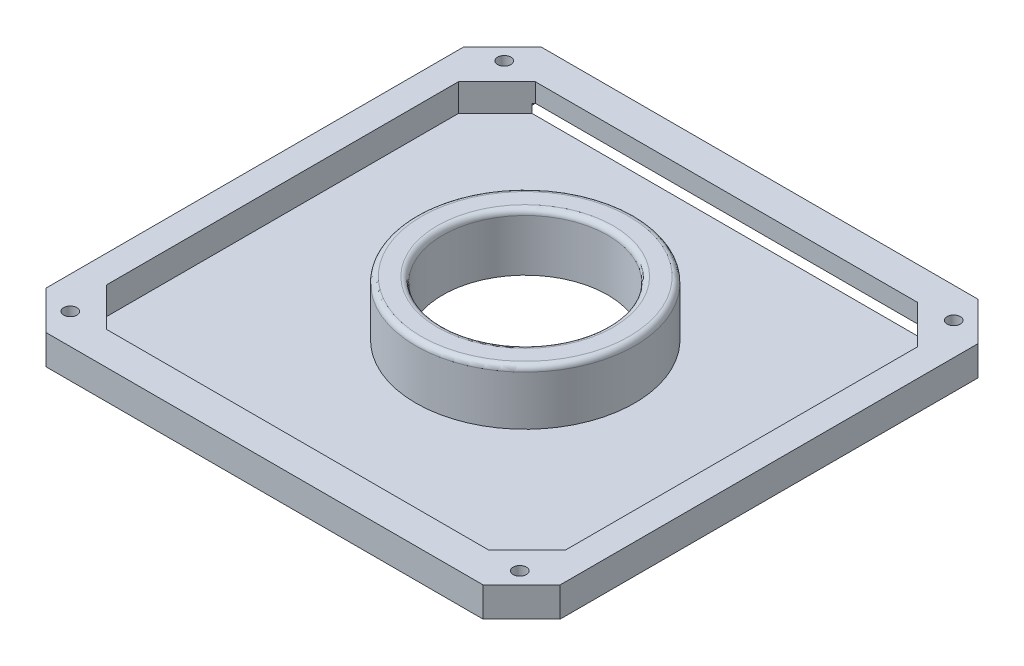
ISO-10303-21;
HEADER;
FILE_DESCRIPTION(('STEP AP214'),'2;1');
FILE_NAME('part.step','',(''),(''),'','','');
FILE_SCHEMA(('AUTOMOTIVE_DESIGN { 1 0 10303 214 1 1 1 1 }'));
ENDSEC;
DATA;
#1=APPLICATION_CONTEXT('core data for automotive mechanical design processes');
#2=APPLICATION_PROTOCOL_DEFINITION('international standard','automotive_design',2000,#1);
#3=PRODUCT_CONTEXT('',#1,'mechanical');
#4=PRODUCT('Part','Part','',(#3));
#5=PRODUCT_RELATED_PRODUCT_CATEGORY('part','',(#4));
#6=PRODUCT_DEFINITION_FORMATION('','',#4);
#7=PRODUCT_DEFINITION_CONTEXT('part definition',#1,'design');
#8=PRODUCT_DEFINITION('design','',#6,#7);
#9=PRODUCT_DEFINITION_SHAPE('','',#8);
#10=(LENGTH_UNIT() NAMED_UNIT(*) SI_UNIT(.MILLI.,.METRE.));
#11=(NAMED_UNIT(*) PLANE_ANGLE_UNIT() SI_UNIT($,.RADIAN.));
#12=(NAMED_UNIT(*) SI_UNIT($,.STERADIAN.) SOLID_ANGLE_UNIT());
#13=UNCERTAINTY_MEASURE_WITH_UNIT(LENGTH_MEASURE(1.E-05),#10,'distance_accuracy_value','');
#14=(GEOMETRIC_REPRESENTATION_CONTEXT(3) GLOBAL_UNCERTAINTY_ASSIGNED_CONTEXT((#13)) GLOBAL_UNIT_ASSIGNED_CONTEXT((#10,
#11,#12)) REPRESENTATION_CONTEXT('',''));
#15=CARTESIAN_POINT('',(0.,0.,0.));
#16=DIRECTION('',(0.,0.,1.));
#17=DIRECTION('',(1.,0.,0.));
#18=AXIS2_PLACEMENT_3D('',#15,#16,#17);
#19=CARTESIAN_POINT('',(46.75,0.,-45.));
#20=DIRECTION('',(0.,0.,-1.));
#21=DIRECTION('',(-1.,0.,0.));
#22=AXIS2_PLACEMENT_3D('',#19,#20,#21);
#23=PLANE('',#22);
#24=DIRECTION('',(-1.,0.,0.));
#25=VECTOR('',#24,1.);
#26=CARTESIAN_POINT('',(46.75,0.,-45.));
#27=LINE('',#26,#25);
#28=CARTESIAN_POINT('',(39.7499999999999,0.,-45.));
#29=VERTEX_POINT('',#28);
#30=CARTESIAN_POINT('',(36.75,0.,-45.));
#31=VERTEX_POINT('',#30);
#32=EDGE_CURVE('E222',#29,#31,#27,.T.);
#33=ORIENTED_EDGE('',*,*,#32,.T.);
#34=DIRECTION('',(0.,-1.,0.));
#35=VECTOR('',#34,1.);
#36=CARTESIAN_POINT('',(36.75,2.,-45.));
#37=LINE('',#36,#35);
#38=CARTESIAN_POINT('',(36.75,2.,-45.));
#39=VERTEX_POINT('',#38);
#40=EDGE_CURVE('E203',#39,#31,#37,.T.);
#41=ORIENTED_EDGE('',*,*,#40,.F.);
#42=DIRECTION('',(-1.,0.,0.));
#43=VECTOR('',#42,1.);
#44=CARTESIAN_POINT('',(36.75,2.,-45.));
#45=LINE('',#44,#43);
#46=CARTESIAN_POINT('',(-36.75,2.,-45.));
#47=VERTEX_POINT('',#46);
#48=EDGE_CURVE('E210',#39,#47,#45,.T.);
#49=ORIENTED_EDGE('',*,*,#48,.T.);
#50=DIRECTION('',(0.,-1.,0.));
#51=VECTOR('',#50,1.);
#52=CARTESIAN_POINT('',(-36.75,2.,-45.));
#53=LINE('',#52,#51);
#54=CARTESIAN_POINT('',(-36.75,0.,-45.));
#55=VERTEX_POINT('',#54);
#56=EDGE_CURVE('E228',#47,#55,#53,.T.);
#57=ORIENTED_EDGE('',*,*,#56,.T.);
#58=CARTESIAN_POINT('',(-39.75,0.,-45.));
#59=VERTEX_POINT('',#58);
#60=EDGE_CURVE('E281',#55,#59,#27,.T.);
#61=ORIENTED_EDGE('',*,*,#60,.T.);
#62=DIRECTION('',(0.,1.,0.));
#63=VECTOR('',#62,1.);
#64=CARTESIAN_POINT('',(-39.75,0.,-45.));
#65=LINE('',#64,#63);
#66=CARTESIAN_POINT('',(-39.75,5.4,-45.));
#67=VERTEX_POINT('',#66);
#68=EDGE_CURVE('E333',#59,#67,#65,.T.);
#69=ORIENTED_EDGE('',*,*,#68,.T.);
#70=DIRECTION('',(-1.,0.,0.));
#71=VECTOR('',#70,1.);
#72=CARTESIAN_POINT('',(46.75,5.4,-45.));
#73=LINE('',#72,#71);
#74=CARTESIAN_POINT('',(39.7499999999999,5.4,-45.));
#75=VERTEX_POINT('',#74);
#76=EDGE_CURVE('E278',#75,#67,#73,.T.);
#77=ORIENTED_EDGE('',*,*,#76,.F.);
#78=DIRECTION('',(0.,-1.,0.));
#79=VECTOR('',#78,1.);
#80=CARTESIAN_POINT('',(39.7499999999999,0.,-45.));
#81=LINE('',#80,#79);
#82=EDGE_CURVE('E329',#75,#29,#81,.T.);
#83=ORIENTED_EDGE('',*,*,#82,.T.);
#84=EDGE_LOOP('',(#33,#41,#49,#57,#61,#69,#77,#83));
#85=FACE_BOUND('',#84,.T.);
#86=ADVANCED_FACE('F35',(#85),#23,.T.);
#87=CARTESIAN_POINT('',(0.,0.,0.));
#88=DIRECTION('',(0.,1.,0.));
#89=DIRECTION('',(0.,0.,1.));
#90=AXIS2_PLACEMENT_3D('',#87,#88,#89);
#91=PLANE('',#90);
#92=CARTESIAN_POINT('',(-6.84106249782944E-12,0.,-2.40478802439185));
#93=DIRECTION('',(0.,1.,0.));
#94=DIRECTION('',(0.,0.,1.));
#95=AXIS2_PLACEMENT_3D('',#92,#93,#94);
#96=CIRCLE('',#95,15.);
#97=CARTESIAN_POINT('',(-6.84106249782944E-12,0.,12.5952119756082));
#98=VERTEX_POINT('',#97);
#99=EDGE_CURVE('E418',#98,#98,#96,.T.);
#100=ORIENTED_EDGE('',*,*,#99,.T.);
#101=EDGE_LOOP('',(#100));
#102=FACE_BOUND('',#101,.T.);
#103=CARTESIAN_POINT('',(-40.8711804126844,0.,39.4578599479724));
#104=DIRECTION('',(0.,1.,0.));
#105=DIRECTION('',(0.,0.,1.));
#106=AXIS2_PLACEMENT_3D('',#103,#104,#105);
#107=CIRCLE('',#106,1.19999999999998);
#108=CARTESIAN_POINT('',(-40.8711804126844,0.,40.6578599479724));
#109=VERTEX_POINT('',#108);
#110=EDGE_CURVE('E423',#109,#109,#107,.T.);
#111=ORIENTED_EDGE('',*,*,#110,.T.);
#112=EDGE_LOOP('',(#111));
#113=FACE_BOUND('',#112,.T.);
#114=CARTESIAN_POINT('',(-40.8711804126844,0.,-39.4578599479724));
#115=DIRECTION('',(0.,1.,0.));
#116=DIRECTION('',(0.,0.,1.));
#117=AXIS2_PLACEMENT_3D('',#114,#115,#116);
#118=CIRCLE('',#117,1.19999999999998);
#119=CARTESIAN_POINT('',(-40.8711804126844,0.,-38.2578599479724));
#120=VERTEX_POINT('',#119);
#121=EDGE_CURVE('E431',#120,#120,#118,.T.);
#122=ORIENTED_EDGE('',*,*,#121,.T.);
#123=EDGE_LOOP('',(#122));
#124=FACE_BOUND('',#123,.T.);
#125=CARTESIAN_POINT('',(40.8711804126844,0.,-39.4578599479724));
#126=DIRECTION('',(0.,1.,0.));
#127=DIRECTION('',(0.,0.,1.));
#128=AXIS2_PLACEMENT_3D('',#125,#126,#127);
#129=CIRCLE('',#128,1.19999999999998);
#130=CARTESIAN_POINT('',(40.8711804126844,0.,-38.2578599479724));
#131=VERTEX_POINT('',#130);
#132=EDGE_CURVE('E437',#131,#131,#129,.T.);
#133=ORIENTED_EDGE('',*,*,#132,.T.);
#134=EDGE_LOOP('',(#133));
#135=FACE_BOUND('',#134,.T.);
#136=CARTESIAN_POINT('',(40.8711804126844,0.,39.4578599479724));
#137=DIRECTION('',(0.,1.,0.));
#138=DIRECTION('',(0.,0.,1.));
#139=AXIS2_PLACEMENT_3D('',#136,#137,#138);
#140=CIRCLE('',#139,1.19999999999998);
#141=CARTESIAN_POINT('',(40.8711804126844,0.,40.6578599479724));
#142=VERTEX_POINT('',#141);
#143=EDGE_CURVE('E443',#142,#142,#140,.T.);
#144=ORIENTED_EDGE('',*,*,#143,.T.);
#145=EDGE_LOOP('',(#144));
#146=FACE_BOUND('',#145,.T.);
#147=DIRECTION('',(0.,0.,1.));
#148=VECTOR('',#147,1.);
#149=CARTESIAN_POINT('',(36.75,0.,-45.));
#150=LINE('',#149,#148);
#151=CARTESIAN_POINT('',(36.75,0.,-39.7047880243918));
#152=VERTEX_POINT('',#151);
#153=EDGE_CURVE('E218',#31,#152,#150,.T.);
#154=ORIENTED_EDGE('',*,*,#153,.F.);
#155=ORIENTED_EDGE('',*,*,#32,.F.);
#156=DIRECTION('',(-0.70710678118655,0.,-0.707106781186545));
#157=VECTOR('',#156,1.);
#158=CARTESIAN_POINT('',(46.75,0.,-38.));
#159=LINE('',#158,#157);
#160=CARTESIAN_POINT('',(46.75,0.,-38.));
#161=VERTEX_POINT('',#160);
#162=EDGE_CURVE('E331',#29,#161,#159,.F.);
#163=ORIENTED_EDGE('',*,*,#162,.T.);
#164=DIRECTION('',(0.,0.,-1.));
#165=VECTOR('',#164,1.);
#166=CARTESIAN_POINT('',(46.75,0.,45.));
#167=LINE('',#166,#165);
#168=CARTESIAN_POINT('',(46.75,0.,38.));
#169=VERTEX_POINT('',#168);
#170=EDGE_CURVE('E286',#169,#161,#167,.T.);
#171=ORIENTED_EDGE('',*,*,#170,.F.);
#172=DIRECTION('',(0.707106781186546,0.,-0.707106781186549));
#173=VECTOR('',#172,1.);
#174=CARTESIAN_POINT('',(39.75,0.,45.));
#175=LINE('',#174,#173);
#176=CARTESIAN_POINT('',(39.75,0.,45.));
#177=VERTEX_POINT('',#176);
#178=EDGE_CURVE('E321',#169,#177,#175,.F.);
#179=ORIENTED_EDGE('',*,*,#178,.T.);
#180=DIRECTION('',(1.,0.,0.));
#181=VECTOR('',#180,1.);
#182=CARTESIAN_POINT('',(-46.75,0.,45.));
#183=LINE('',#182,#181);
#184=CARTESIAN_POINT('',(-39.75,0.,45.));
#185=VERTEX_POINT('',#184);
#186=EDGE_CURVE('E284',#185,#177,#183,.T.);
#187=ORIENTED_EDGE('',*,*,#186,.F.);
#188=DIRECTION('',(0.70710678118655,0.,0.707106781186545));
#189=VECTOR('',#188,1.);
#190=CARTESIAN_POINT('',(-46.75,0.,38.));
#191=LINE('',#190,#189);
#192=CARTESIAN_POINT('',(-46.75,0.,38.));
#193=VERTEX_POINT('',#192);
#194=EDGE_CURVE('E360',#185,#193,#191,.F.);
#195=ORIENTED_EDGE('',*,*,#194,.T.);
#196=DIRECTION('',(0.,0.,1.));
#197=VECTOR('',#196,1.);
#198=CARTESIAN_POINT('',(-46.75,0.,-45.));
#199=LINE('',#198,#197);
#200=CARTESIAN_POINT('',(-46.75,0.,-38.));
#201=VERTEX_POINT('',#200);
#202=EDGE_CURVE('E280',#201,#193,#199,.T.);
#203=ORIENTED_EDGE('',*,*,#202,.F.);
#204=DIRECTION('',(-0.707106781186545,0.,0.70710678118655));
#205=VECTOR('',#204,1.);
#206=CARTESIAN_POINT('',(-39.75,0.,-45.));
#207=LINE('',#206,#205);
#208=EDGE_CURVE('E340',#201,#59,#207,.F.);
#209=ORIENTED_EDGE('',*,*,#208,.T.);
#210=ORIENTED_EDGE('',*,*,#60,.F.);
#211=DIRECTION('',(0.,0.,1.));
#212=VECTOR('',#211,1.);
#213=CARTESIAN_POINT('',(-36.75,0.,-45.));
#214=LINE('',#213,#212);
#215=CARTESIAN_POINT('',(-36.75,0.,-39.7047880243918));
#216=VERTEX_POINT('',#215);
#217=EDGE_CURVE('E207',#55,#216,#214,.T.);
#218=ORIENTED_EDGE('',*,*,#217,.T.);
#219=CARTESIAN_POINT('',(-35.75,0.,-39.7047880243918));
#220=DIRECTION('',(0.,1.,0.));
#221=DIRECTION('',(0.,0.,1.));
#222=AXIS2_PLACEMENT_3D('',#219,#220,#221);
#223=CIRCLE('',#222,1.);
#224=CARTESIAN_POINT('',(-35.75,0.,-38.7047880243918));
#225=VERTEX_POINT('',#224);
#226=EDGE_CURVE('E379',#216,#225,#223,.T.);
#227=ORIENTED_EDGE('',*,*,#226,.T.);
#228=DIRECTION('',(-1.,0.,0.));
#229=VECTOR('',#228,1.);
#230=CARTESIAN_POINT('',(36.75,0.,-38.7047880243918));
#231=LINE('',#230,#229);
#232=CARTESIAN_POINT('',(35.75,0.,-38.7047880243918));
#233=VERTEX_POINT('',#232);
#234=EDGE_CURVE('E217',#233,#225,#231,.T.);
#235=ORIENTED_EDGE('',*,*,#234,.F.);
#236=CARTESIAN_POINT('',(35.75,0.,-39.7047880243918));
#237=DIRECTION('',(0.,1.,0.));
#238=DIRECTION('',(0.,0.,1.));
#239=AXIS2_PLACEMENT_3D('',#236,#237,#238);
#240=CIRCLE('',#239,1.);
#241=EDGE_CURVE('E50',#233,#152,#240,.T.);
#242=ORIENTED_EDGE('',*,*,#241,.T.);
#243=EDGE_LOOP('',(#154,#155,#163,#171,#179,#187,#195,#203,#209,#210,#218,#227,#235,#242));
#244=FACE_BOUND('',#243,.T.);
#245=ADVANCED_FACE('F503',(#102,#113,#124,#135,#146,#244),#91,.F.);
#246=CARTESIAN_POINT('',(46.75,0.,45.));
#247=DIRECTION('',(1.,0.,0.));
#248=DIRECTION('',(0.,0.,-1.));
#249=AXIS2_PLACEMENT_3D('',#246,#247,#248);
#250=PLANE('',#249);
#251=ORIENTED_EDGE('',*,*,#170,.T.);
#252=DIRECTION('',(0.,1.,0.));
#253=VECTOR('',#252,1.);
#254=CARTESIAN_POINT('',(46.75,0.,-38.));
#255=LINE('',#254,#253);
#256=CARTESIAN_POINT('',(46.75,5.4,-38.));
#257=VERTEX_POINT('',#256);
#258=EDGE_CURVE('E324',#161,#257,#255,.T.);
#259=ORIENTED_EDGE('',*,*,#258,.T.);
#260=DIRECTION('',(0.,0.,-1.));
#261=VECTOR('',#260,1.);
#262=CARTESIAN_POINT('',(46.75,5.4,45.));
#263=LINE('',#262,#261);
#264=CARTESIAN_POINT('',(46.75,5.4,38.));
#265=VERTEX_POINT('',#264);
#266=EDGE_CURVE('E297',#265,#257,#263,.T.);
#267=ORIENTED_EDGE('',*,*,#266,.F.);
#268=DIRECTION('',(0.,-1.,0.));
#269=VECTOR('',#268,1.);
#270=CARTESIAN_POINT('',(46.75,0.,38.));
#271=LINE('',#270,#269);
#272=EDGE_CURVE('E319',#265,#169,#271,.T.);
#273=ORIENTED_EDGE('',*,*,#272,.T.);
#274=EDGE_LOOP('',(#251,#259,#267,#273));
#275=FACE_BOUND('',#274,.T.);
#276=ADVANCED_FACE('F519',(#275),#250,.T.);
#277=CARTESIAN_POINT('',(-46.75,0.,45.));
#278=DIRECTION('',(0.,0.,1.));
#279=DIRECTION('',(1.,0.,0.));
#280=AXIS2_PLACEMENT_3D('',#277,#278,#279);
#281=PLANE('',#280);
#282=DIRECTION('',(1.,0.,0.));
#283=VECTOR('',#282,1.);
#284=CARTESIAN_POINT('',(-46.75,5.4,45.));
#285=LINE('',#284,#283);
#286=CARTESIAN_POINT('',(-39.75,5.4,45.));
#287=VERTEX_POINT('',#286);
#288=CARTESIAN_POINT('',(39.75,5.4,45.));
#289=VERTEX_POINT('',#288);
#290=EDGE_CURVE('E295',#287,#289,#285,.T.);
#291=ORIENTED_EDGE('',*,*,#290,.F.);
#292=DIRECTION('',(0.,-1.,0.));
#293=VECTOR('',#292,1.);
#294=CARTESIAN_POINT('',(-39.75,0.,45.));
#295=LINE('',#294,#293);
#296=EDGE_CURVE('E358',#287,#185,#295,.T.);
#297=ORIENTED_EDGE('',*,*,#296,.T.);
#298=ORIENTED_EDGE('',*,*,#186,.T.);
#299=DIRECTION('',(0.,1.,0.));
#300=VECTOR('',#299,1.);
#301=CARTESIAN_POINT('',(39.75,0.,45.));
#302=LINE('',#301,#300);
#303=EDGE_CURVE('E314',#177,#289,#302,.T.);
#304=ORIENTED_EDGE('',*,*,#303,.T.);
#305=EDGE_LOOP('',(#291,#297,#298,#304));
#306=FACE_BOUND('',#305,.T.);
#307=ADVANCED_FACE('F530',(#306),#281,.T.);
#308=CARTESIAN_POINT('',(-46.75,0.,-45.));
#309=DIRECTION('',(-1.,0.,0.));
#310=DIRECTION('',(0.,0.,1.));
#311=AXIS2_PLACEMENT_3D('',#308,#309,#310);
#312=PLANE('',#311);
#313=ORIENTED_EDGE('',*,*,#202,.T.);
#314=DIRECTION('',(0.,1.,0.));
#315=VECTOR('',#314,1.);
#316=CARTESIAN_POINT('',(-46.75,0.,38.));
#317=LINE('',#316,#315);
#318=CARTESIAN_POINT('',(-46.75,5.4,38.));
#319=VERTEX_POINT('',#318);
#320=EDGE_CURVE('E353',#193,#319,#317,.T.);
#321=ORIENTED_EDGE('',*,*,#320,.T.);
#322=DIRECTION('',(0.,0.,1.));
#323=VECTOR('',#322,1.);
#324=CARTESIAN_POINT('',(-46.75,5.4,-45.));
#325=LINE('',#324,#323);
#326=CARTESIAN_POINT('',(-46.75,5.4,-38.));
#327=VERTEX_POINT('',#326);
#328=EDGE_CURVE('E292',#327,#319,#325,.T.);
#329=ORIENTED_EDGE('',*,*,#328,.F.);
#330=DIRECTION('',(0.,-1.,0.));
#331=VECTOR('',#330,1.);
#332=CARTESIAN_POINT('',(-46.75,0.,-38.));
#333=LINE('',#332,#331);
#334=EDGE_CURVE('E338',#327,#201,#333,.T.);
#335=ORIENTED_EDGE('',*,*,#334,.T.);
#336=EDGE_LOOP('',(#313,#321,#329,#335));
#337=FACE_BOUND('',#336,.T.);
#338=ADVANCED_FACE('F537',(#337),#312,.T.);
#339=CARTESIAN_POINT('',(0.,5.4,0.));
#340=DIRECTION('',(0.,1.,0.));
#341=DIRECTION('',(0.,0.,1.));
#342=AXIS2_PLACEMENT_3D('',#339,#340,#341);
#343=PLANE('',#342);
#344=CARTESIAN_POINT('',(-40.8711804126844,5.4,39.4578599479724));
#345=DIRECTION('',(0.,1.,0.));
#346=DIRECTION('',(0.,0.,1.));
#347=AXIS2_PLACEMENT_3D('',#344,#345,#346);
#348=CIRCLE('',#347,1.19999999999998);
#349=CARTESIAN_POINT('',(-40.8711804126844,5.4,40.6578599479724));
#350=VERTEX_POINT('',#349);
#351=EDGE_CURVE('E420',#350,#350,#348,.T.);
#352=ORIENTED_EDGE('',*,*,#351,.F.);
#353=EDGE_LOOP('',(#352));
#354=FACE_BOUND('',#353,.T.);
#355=CARTESIAN_POINT('',(-40.8711804126844,5.4,-39.4578599479724));
#356=DIRECTION('',(0.,1.,0.));
#357=DIRECTION('',(0.,0.,1.));
#358=AXIS2_PLACEMENT_3D('',#355,#356,#357);
#359=CIRCLE('',#358,1.19999999999998);
#360=CARTESIAN_POINT('',(-40.8711804126844,5.4,-38.2578599479724));
#361=VERTEX_POINT('',#360);
#362=EDGE_CURVE('E428',#361,#361,#359,.T.);
#363=ORIENTED_EDGE('',*,*,#362,.F.);
#364=EDGE_LOOP('',(#363));
#365=FACE_BOUND('',#364,.T.);
#366=CARTESIAN_POINT('',(40.8711804126844,5.4,-39.4578599479724));
#367=DIRECTION('',(0.,1.,0.));
#368=DIRECTION('',(0.,0.,1.));
#369=AXIS2_PLACEMENT_3D('',#366,#367,#368);
#370=CIRCLE('',#369,1.19999999999998);
#371=CARTESIAN_POINT('',(40.8711804126844,5.4,-38.2578599479724));
#372=VERTEX_POINT('',#371);
#373=EDGE_CURVE('E434',#372,#372,#370,.T.);
#374=ORIENTED_EDGE('',*,*,#373,.F.);
#375=EDGE_LOOP('',(#374));
#376=FACE_BOUND('',#375,.T.);
#377=CARTESIAN_POINT('',(40.8711804126844,5.4,39.4578599479724));
#378=DIRECTION('',(0.,1.,0.));
#379=DIRECTION('',(0.,0.,1.));
#380=AXIS2_PLACEMENT_3D('',#377,#378,#379);
#381=CIRCLE('',#380,1.19999999999998);
#382=CARTESIAN_POINT('',(40.8711804126844,5.4,40.6578599479724));
#383=VERTEX_POINT('',#382);
#384=EDGE_CURVE('E440',#383,#383,#381,.T.);
#385=ORIENTED_EDGE('',*,*,#384,.F.);
#386=EDGE_LOOP('',(#385));
#387=FACE_BOUND('',#386,.T.);
#388=DIRECTION('',(-1.,0.,0.));
#389=VECTOR('',#388,1.);
#390=CARTESIAN_POINT('',(41.75,5.4,39.));
#391=LINE('',#390,#389);
#392=CARTESIAN_POINT('',(34.75,5.4,39.));
#393=VERTEX_POINT('',#392);
#394=CARTESIAN_POINT('',(-34.75,5.4,39.));
#395=VERTEX_POINT('',#394);
#396=EDGE_CURVE('E268',#393,#395,#391,.T.);
#397=ORIENTED_EDGE('',*,*,#396,.T.);
#398=DIRECTION('',(0.707106781186551,0.,0.707106781186544));
#399=VECTOR('',#398,1.);
#400=CARTESIAN_POINT('',(-41.75,5.4,32.));
#401=LINE('',#400,#399);
#402=CARTESIAN_POINT('',(-41.75,5.4,32.));
#403=VERTEX_POINT('',#402);
#404=EDGE_CURVE('E366',#395,#403,#401,.F.);
#405=ORIENTED_EDGE('',*,*,#404,.T.);
#406=DIRECTION('',(0.,0.,-1.));
#407=VECTOR('',#406,1.);
#408=CARTESIAN_POINT('',(-41.75,5.4,39.));
#409=LINE('',#408,#407);
#410=CARTESIAN_POINT('',(-41.75,5.4,-32.));
#411=VERTEX_POINT('',#410);
#412=EDGE_CURVE('E271',#403,#411,#409,.T.);
#413=ORIENTED_EDGE('',*,*,#412,.T.);
#414=DIRECTION('',(-0.707106781186551,0.,0.707106781186544));
#415=VECTOR('',#414,1.);
#416=CARTESIAN_POINT('',(-34.75,5.4,-39.));
#417=LINE('',#416,#415);
#418=CARTESIAN_POINT('',(-34.75,5.4,-39.));
#419=VERTEX_POINT('',#418);
#420=EDGE_CURVE('E351',#411,#419,#417,.F.);
#421=ORIENTED_EDGE('',*,*,#420,.T.);
#422=DIRECTION('',(1.,0.,0.));
#423=VECTOR('',#422,1.);
#424=CARTESIAN_POINT('',(-41.75,5.4,-39.));
#425=LINE('',#424,#423);
#426=CARTESIAN_POINT('',(34.75,5.4,-39.));
#427=VERTEX_POINT('',#426);
#428=EDGE_CURVE('E276',#419,#427,#425,.T.);
#429=ORIENTED_EDGE('',*,*,#428,.T.);
#430=DIRECTION('',(-0.707106781186549,0.,-0.707106781186546));
#431=VECTOR('',#430,1.);
#432=CARTESIAN_POINT('',(41.75,5.4,-32.));
#433=LINE('',#432,#431);
#434=CARTESIAN_POINT('',(41.75,5.4,-32.));
#435=VERTEX_POINT('',#434);
#436=EDGE_CURVE('E306',#427,#435,#433,.F.);
#437=ORIENTED_EDGE('',*,*,#436,.T.);
#438=DIRECTION('',(0.,0.,1.));
#439=VECTOR('',#438,1.);
#440=CARTESIAN_POINT('',(41.75,5.4,-39.));
#441=LINE('',#440,#439);
#442=CARTESIAN_POINT('',(41.75,5.4,32.));
#443=VERTEX_POINT('',#442);
#444=EDGE_CURVE('E264',#435,#443,#441,.T.);
#445=ORIENTED_EDGE('',*,*,#444,.T.);
#446=DIRECTION('',(0.707106781186545,0.,-0.70710678118655));
#447=VECTOR('',#446,1.);
#448=CARTESIAN_POINT('',(34.75,5.4,39.));
#449=LINE('',#448,#447);
#450=EDGE_CURVE('E312',#443,#393,#449,.F.);
#451=ORIENTED_EDGE('',*,*,#450,.T.);
#452=EDGE_LOOP('',(#397,#405,#413,#421,#429,#437,#445,#451));
#453=FACE_BOUND('',#452,.T.);
#454=ORIENTED_EDGE('',*,*,#328,.T.);
#455=DIRECTION('',(-0.70710678118655,0.,-0.707106781186545));
#456=VECTOR('',#455,1.);
#457=CARTESIAN_POINT('',(-42.3749999999998,5.4,42.3750000000001));
#458=LINE('',#457,#456);
#459=EDGE_CURVE('E356',#319,#287,#458,.F.);
#460=ORIENTED_EDGE('',*,*,#459,.T.);
#461=ORIENTED_EDGE('',*,*,#290,.T.);
#462=DIRECTION('',(-0.707106781186546,0.,0.707106781186549));
#463=VECTOR('',#462,1.);
#464=CARTESIAN_POINT('',(42.3750000000001,5.4,42.3749999999999));
#465=LINE('',#464,#463);
#466=EDGE_CURVE('E317',#289,#265,#465,.F.);
#467=ORIENTED_EDGE('',*,*,#466,.T.);
#468=ORIENTED_EDGE('',*,*,#266,.T.);
#469=DIRECTION('',(0.70710678118655,0.,0.707106781186545));
#470=VECTOR('',#469,1.);
#471=CARTESIAN_POINT('',(42.3749999999999,5.4,-42.3750000000001));
#472=LINE('',#471,#470);
#473=EDGE_CURVE('E327',#257,#75,#472,.F.);
#474=ORIENTED_EDGE('',*,*,#473,.T.);
#475=ORIENTED_EDGE('',*,*,#76,.T.);
#476=DIRECTION('',(0.707106781186545,0.,-0.70710678118655));
#477=VECTOR('',#476,1.);
#478=CARTESIAN_POINT('',(-42.3750000000001,5.4,-42.3749999999999));
#479=LINE('',#478,#477);
#480=EDGE_CURVE('E336',#67,#327,#479,.F.);
#481=ORIENTED_EDGE('',*,*,#480,.T.);
#482=EDGE_LOOP('',(#454,#460,#461,#467,#468,#474,#475,#481));
#483=FACE_BOUND('',#482,.T.);
#484=ADVANCED_FACE('F476',(#354,#365,#376,#387,#453,#483),#343,.T.);
#485=CARTESIAN_POINT('',(-41.75,5.401,39.));
#486=DIRECTION('',(-1.,0.,0.));
#487=DIRECTION('',(0.,0.,1.));
#488=AXIS2_PLACEMENT_3D('',#485,#486,#487);
#489=PLANE('',#488);
#490=ORIENTED_EDGE('',*,*,#412,.F.);
#491=DIRECTION('',(0.,-1.,0.));
#492=VECTOR('',#491,1.);
#493=CARTESIAN_POINT('',(-41.75,2.,32.));
#494=LINE('',#493,#492);
#495=CARTESIAN_POINT('',(-41.75,0.400000000000001,32.));
#496=VERTEX_POINT('',#495);
#497=EDGE_CURVE('E362',#403,#496,#494,.T.);
#498=ORIENTED_EDGE('',*,*,#497,.T.);
#499=DIRECTION('',(0.,0.,-1.));
#500=VECTOR('',#499,1.);
#501=CARTESIAN_POINT('',(-41.75,0.400000000000001,32.));
#502=LINE('',#501,#500);
#503=CARTESIAN_POINT('',(-41.75,0.400000000000001,-32.));
#504=VERTEX_POINT('',#503);
#505=EDGE_CURVE('E234',#496,#504,#502,.T.);
#506=ORIENTED_EDGE('',*,*,#505,.T.);
#507=DIRECTION('',(0.,1.,0.));
#508=VECTOR('',#507,1.);
#509=CARTESIAN_POINT('',(-41.75,5.4,-32.));
#510=LINE('',#509,#508);
#511=EDGE_CURVE('E348',#504,#411,#510,.T.);
#512=ORIENTED_EDGE('',*,*,#511,.T.);
#513=EDGE_LOOP('',(#490,#498,#506,#512));
#514=FACE_BOUND('',#513,.T.);
#515=ADVANCED_FACE('F494',(#514),#489,.F.);
#516=CARTESIAN_POINT('',(41.75,5.401,39.));
#517=DIRECTION('',(0.,0.,1.));
#518=DIRECTION('',(1.,0.,0.));
#519=AXIS2_PLACEMENT_3D('',#516,#517,#518);
#520=PLANE('',#519);
#521=DIRECTION('',(0.,-1.,0.));
#522=VECTOR('',#521,1.);
#523=CARTESIAN_POINT('',(34.75,2.,39.));
#524=LINE('',#523,#522);
#525=CARTESIAN_POINT('',(34.75,0.400000000000001,39.));
#526=VERTEX_POINT('',#525);
#527=EDGE_CURVE('E308',#393,#526,#524,.T.);
#528=ORIENTED_EDGE('',*,*,#527,.T.);
#529=DIRECTION('',(-1.,0.,0.));
#530=VECTOR('',#529,1.);
#531=CARTESIAN_POINT('',(34.75,0.400000000000001,39.));
#532=LINE('',#531,#530);
#533=CARTESIAN_POINT('',(-34.75,0.400000000000001,39.));
#534=VERTEX_POINT('',#533);
#535=EDGE_CURVE('E254',#526,#534,#532,.T.);
#536=ORIENTED_EDGE('',*,*,#535,.T.);
#537=DIRECTION('',(0.,1.,0.));
#538=VECTOR('',#537,1.);
#539=CARTESIAN_POINT('',(-34.75,5.4,39.));
#540=LINE('',#539,#538);
#541=EDGE_CURVE('E364',#534,#395,#540,.T.);
#542=ORIENTED_EDGE('',*,*,#541,.T.);
#543=ORIENTED_EDGE('',*,*,#396,.F.);
#544=EDGE_LOOP('',(#528,#536,#542,#543));
#545=FACE_BOUND('',#544,.T.);
#546=ADVANCED_FACE('F464',(#545),#520,.F.);
#547=CARTESIAN_POINT('',(41.75,5.401,-39.));
#548=DIRECTION('',(1.,0.,0.));
#549=DIRECTION('',(0.,0.,-1.));
#550=AXIS2_PLACEMENT_3D('',#547,#548,#549);
#551=PLANE('',#550);
#552=DIRECTION('',(0.,-1.,0.));
#553=VECTOR('',#552,1.);
#554=CARTESIAN_POINT('',(41.75,2.,-32.));
#555=LINE('',#554,#553);
#556=CARTESIAN_POINT('',(41.75,0.400000000000001,-32.));
#557=VERTEX_POINT('',#556);
#558=EDGE_CURVE('E289',#435,#557,#555,.T.);
#559=ORIENTED_EDGE('',*,*,#558,.T.);
#560=DIRECTION('',(0.,0.,1.));
#561=VECTOR('',#560,1.);
#562=CARTESIAN_POINT('',(41.75,0.400000000000001,-32.));
#563=LINE('',#562,#561);
#564=CARTESIAN_POINT('',(41.75,0.400000000000001,32.));
#565=VERTEX_POINT('',#564);
#566=EDGE_CURVE('E248',#557,#565,#563,.T.);
#567=ORIENTED_EDGE('',*,*,#566,.T.);
#568=DIRECTION('',(0.,1.,0.));
#569=VECTOR('',#568,1.);
#570=CARTESIAN_POINT('',(41.75,5.4,32.));
#571=LINE('',#570,#569);
#572=EDGE_CURVE('E310',#565,#443,#571,.T.);
#573=ORIENTED_EDGE('',*,*,#572,.T.);
#574=ORIENTED_EDGE('',*,*,#444,.F.);
#575=EDGE_LOOP('',(#559,#567,#573,#574));
#576=FACE_BOUND('',#575,.T.);
#577=ADVANCED_FACE('F473',(#576),#551,.F.);
#578=CARTESIAN_POINT('',(-41.75,5.401,-39.));
#579=DIRECTION('',(0.,0.,-1.));
#580=DIRECTION('',(-1.,0.,0.));
#581=AXIS2_PLACEMENT_3D('',#578,#579,#580);
#582=PLANE('',#581);
#583=ORIENTED_EDGE('',*,*,#428,.F.);
#584=DIRECTION('',(0.,-1.,0.));
#585=VECTOR('',#584,1.);
#586=CARTESIAN_POINT('',(-34.75,2.,-39.));
#587=LINE('',#586,#585);
#588=CARTESIAN_POINT('',(-34.75,2.,-39.));
#589=VERTEX_POINT('',#588);
#590=EDGE_CURVE('E343',#419,#589,#587,.T.);
#591=ORIENTED_EDGE('',*,*,#590,.T.);
#592=DIRECTION('',(1.,0.,0.));
#593=VECTOR('',#592,1.);
#594=CARTESIAN_POINT('',(-41.75,2.,-39.));
#595=LINE('',#594,#593);
#596=CARTESIAN_POINT('',(34.75,2.,-39.));
#597=VERTEX_POINT('',#596);
#598=EDGE_CURVE('E273',#589,#597,#595,.T.);
#599=ORIENTED_EDGE('',*,*,#598,.T.);
#600=DIRECTION('',(0.,1.,0.));
#601=VECTOR('',#600,1.);
#602=CARTESIAN_POINT('',(34.75,5.4,-39.));
#603=LINE('',#602,#601);
#604=EDGE_CURVE('E303',#597,#427,#603,.T.);
#605=ORIENTED_EDGE('',*,*,#604,.T.);
#606=EDGE_LOOP('',(#583,#591,#599,#605));
#607=FACE_BOUND('',#606,.T.);
#608=ADVANCED_FACE('F496',(#607),#582,.F.);
#609=CARTESIAN_POINT('',(41.75,5.401,-32.));
#610=DIRECTION('',(-0.707106781186546,0.,0.707106781186549));
#611=DIRECTION('',(0.,1.,0.));
#612=AXIS2_PLACEMENT_3D('',#609,#610,#611);
#613=PLANE('',#612);
#614=ORIENTED_EDGE('',*,*,#436,.F.);
#615=ORIENTED_EDGE('',*,*,#604,.F.);
#616=DIRECTION('',(0.707106781186549,0.,0.707106781186546));
#617=VECTOR('',#616,1.);
#618=CARTESIAN_POINT('',(41.75,2.,-32.));
#619=LINE('',#618,#617);
#620=CARTESIAN_POINT('',(35.0452119756082,2.,-38.7047880243918));
#621=VERTEX_POINT('',#620);
#622=EDGE_CURVE('E301',#621,#597,#619,.F.);
#623=ORIENTED_EDGE('',*,*,#622,.F.);
#624=DIRECTION('',(0.,-1.,0.));
#625=VECTOR('',#624,1.);
#626=CARTESIAN_POINT('',(35.0452119756082,5.401,-38.7047880243918));
#627=LINE('',#626,#625);
#628=CARTESIAN_POINT('',(35.0452119756082,0.400000000000001,-38.7047880243918));
#629=VERTEX_POINT('',#628);
#630=EDGE_CURVE('E261',#621,#629,#627,.T.);
#631=ORIENTED_EDGE('',*,*,#630,.T.);
#632=DIRECTION('',(0.707106781186548,0.,0.707106781186548));
#633=VECTOR('',#632,1.);
#634=CARTESIAN_POINT('',(35.0452119756082,0.400000000000001,-38.7047880243918));
#635=LINE('',#634,#633);
#636=EDGE_CURVE('E245',#629,#557,#635,.T.);
#637=ORIENTED_EDGE('',*,*,#636,.T.);
#638=ORIENTED_EDGE('',*,*,#558,.F.);
#639=EDGE_LOOP('',(#614,#615,#623,#631,#637,#638));
#640=FACE_BOUND('',#639,.T.);
#641=ADVANCED_FACE('F482',(#640),#613,.T.);
#642=CARTESIAN_POINT('',(34.75,5.401,39.));
#643=DIRECTION('',(-0.70710678118655,0.,-0.707106781186545));
#644=DIRECTION('',(0.,1.,0.));
#645=AXIS2_PLACEMENT_3D('',#642,#643,#644);
#646=PLANE('',#645);
#647=ORIENTED_EDGE('',*,*,#450,.F.);
#648=ORIENTED_EDGE('',*,*,#572,.F.);
#649=DIRECTION('',(-0.707106781186547,0.,0.707106781186547));
#650=VECTOR('',#649,1.);
#651=CARTESIAN_POINT('',(41.75,0.400000000000001,32.));
#652=LINE('',#651,#650);
#653=EDGE_CURVE('E251',#565,#526,#652,.T.);
#654=ORIENTED_EDGE('',*,*,#653,.T.);
#655=ORIENTED_EDGE('',*,*,#527,.F.);
#656=EDGE_LOOP('',(#647,#648,#654,#655));
#657=FACE_BOUND('',#656,.T.);
#658=ADVANCED_FACE('F470',(#657),#646,.T.);
#659=CARTESIAN_POINT('',(39.75,0.,45.));
#660=DIRECTION('',(-0.707106781186549,0.,-0.707106781186546));
#661=DIRECTION('',(0.,1.,0.));
#662=AXIS2_PLACEMENT_3D('',#659,#660,#661);
#663=PLANE('',#662);
#664=ORIENTED_EDGE('',*,*,#178,.F.);
#665=ORIENTED_EDGE('',*,*,#272,.F.);
#666=ORIENTED_EDGE('',*,*,#466,.F.);
#667=ORIENTED_EDGE('',*,*,#303,.F.);
#668=EDGE_LOOP('',(#664,#665,#666,#667));
#669=FACE_BOUND('',#668,.T.);
#670=ADVANCED_FACE('F526',(#669),#663,.F.);
#671=CARTESIAN_POINT('',(46.75,0.,-38.));
#672=DIRECTION('',(-0.707106781186545,0.,0.70710678118655));
#673=DIRECTION('',(0.,1.,0.));
#674=AXIS2_PLACEMENT_3D('',#671,#672,#673);
#675=PLANE('',#674);
#676=ORIENTED_EDGE('',*,*,#162,.F.);
#677=ORIENTED_EDGE('',*,*,#82,.F.);
#678=ORIENTED_EDGE('',*,*,#473,.F.);
#679=ORIENTED_EDGE('',*,*,#258,.F.);
#680=EDGE_LOOP('',(#676,#677,#678,#679));
#681=FACE_BOUND('',#680,.T.);
#682=ADVANCED_FACE('F517',(#681),#675,.F.);
#683=CARTESIAN_POINT('',(-39.75,0.,-45.));
#684=DIRECTION('',(0.70710678118655,0.,0.707106781186545));
#685=DIRECTION('',(0.,1.,0.));
#686=AXIS2_PLACEMENT_3D('',#683,#684,#685);
#687=PLANE('',#686);
#688=ORIENTED_EDGE('',*,*,#208,.F.);
#689=ORIENTED_EDGE('',*,*,#334,.F.);
#690=ORIENTED_EDGE('',*,*,#480,.F.);
#691=ORIENTED_EDGE('',*,*,#68,.F.);
#692=EDGE_LOOP('',(#688,#689,#690,#691));
#693=FACE_BOUND('',#692,.T.);
#694=ADVANCED_FACE('F509',(#693),#687,.F.);
#695=CARTESIAN_POINT('',(-34.75,5.401,-39.));
#696=DIRECTION('',(0.707106781186544,0.,0.707106781186551));
#697=DIRECTION('',(0.,1.,0.));
#698=AXIS2_PLACEMENT_3D('',#695,#696,#697);
#699=PLANE('',#698);
#700=ORIENTED_EDGE('',*,*,#420,.F.);
#701=ORIENTED_EDGE('',*,*,#511,.F.);
#702=DIRECTION('',(0.707106781186547,0.,-0.707106781186547));
#703=VECTOR('',#702,1.);
#704=CARTESIAN_POINT('',(-41.75,0.400000000000001,-32.));
#705=LINE('',#704,#703);
#706=CARTESIAN_POINT('',(-35.0452119756082,0.400000000000001,-38.7047880243918));
#707=VERTEX_POINT('',#706);
#708=EDGE_CURVE('E240',#504,#707,#705,.T.);
#709=ORIENTED_EDGE('',*,*,#708,.T.);
#710=DIRECTION('',(0.,-1.,0.));
#711=VECTOR('',#710,1.);
#712=CARTESIAN_POINT('',(-35.0452119756082,5.401,-38.7047880243918));
#713=LINE('',#712,#711);
#714=CARTESIAN_POINT('',(-35.0452119756082,2.,-38.7047880243918));
#715=VERTEX_POINT('',#714);
#716=EDGE_CURVE('E260',#715,#707,#713,.T.);
#717=ORIENTED_EDGE('',*,*,#716,.F.);
#718=DIRECTION('',(0.707106781186551,0.,-0.707106781186544));
#719=VECTOR('',#718,1.);
#720=CARTESIAN_POINT('',(-34.75,2.,-39.));
#721=LINE('',#720,#719);
#722=EDGE_CURVE('E346',#589,#715,#721,.F.);
#723=ORIENTED_EDGE('',*,*,#722,.F.);
#724=ORIENTED_EDGE('',*,*,#590,.F.);
#725=EDGE_LOOP('',(#700,#701,#709,#717,#723,#724));
#726=FACE_BOUND('',#725,.T.);
#727=ADVANCED_FACE('F490',(#726),#699,.T.);
#728=CARTESIAN_POINT('',(-46.75,0.,38.));
#729=DIRECTION('',(0.707106781186545,0.,-0.70710678118655));
#730=DIRECTION('',(0.,1.,0.));
#731=AXIS2_PLACEMENT_3D('',#728,#729,#730);
#732=PLANE('',#731);
#733=ORIENTED_EDGE('',*,*,#194,.F.);
#734=ORIENTED_EDGE('',*,*,#296,.F.);
#735=ORIENTED_EDGE('',*,*,#459,.F.);
#736=ORIENTED_EDGE('',*,*,#320,.F.);
#737=EDGE_LOOP('',(#733,#734,#735,#736));
#738=FACE_BOUND('',#737,.T.);
#739=ADVANCED_FACE('F535',(#738),#732,.F.);
#740=CARTESIAN_POINT('',(-41.75,5.401,32.));
#741=DIRECTION('',(0.707106781186544,0.,-0.707106781186551));
#742=DIRECTION('',(0.,1.,0.));
#743=AXIS2_PLACEMENT_3D('',#740,#741,#742);
#744=PLANE('',#743);
#745=ORIENTED_EDGE('',*,*,#404,.F.);
#746=ORIENTED_EDGE('',*,*,#541,.F.);
#747=DIRECTION('',(-0.707106781186548,0.,-0.707106781186547));
#748=VECTOR('',#747,1.);
#749=CARTESIAN_POINT('',(-34.75,0.400000000000001,39.));
#750=LINE('',#749,#748);
#751=EDGE_CURVE('E257',#534,#496,#750,.T.);
#752=ORIENTED_EDGE('',*,*,#751,.T.);
#753=ORIENTED_EDGE('',*,*,#497,.F.);
#754=EDGE_LOOP('',(#745,#746,#752,#753));
#755=FACE_BOUND('',#754,.T.);
#756=ADVANCED_FACE('F451',(#755),#744,.T.);
#757=CARTESIAN_POINT('',(0.,0.400000000000001,0.));
#758=DIRECTION('',(0.,-1.,0.));
#759=DIRECTION('',(0.,0.,-1.));
#760=AXIS2_PLACEMENT_3D('',#757,#758,#759);
#761=PLANE('',#760);
#762=CARTESIAN_POINT('',(-1.85465262789574E-12,0.400000000000005,-2.40478802439185));
#763=DIRECTION('',(0.,-1.,0.));
#764=DIRECTION('',(0.,0.,-1.));
#765=AXIS2_PLACEMENT_3D('',#762,#763,#764);
#766=CIRCLE('',#765,19.9);
#767=CARTESIAN_POINT('',(-1.85465262789574E-12,0.400000000000005,-22.3047880243918));
#768=VERTEX_POINT('',#767);
#769=EDGE_CURVE('E229',#768,#768,#766,.F.);
#770=ORIENTED_EDGE('',*,*,#769,.F.);
#771=EDGE_LOOP('',(#770));
#772=FACE_BOUND('',#771,.T.);
#773=ORIENTED_EDGE('',*,*,#505,.F.);
#774=ORIENTED_EDGE('',*,*,#751,.F.);
#775=ORIENTED_EDGE('',*,*,#535,.F.);
#776=ORIENTED_EDGE('',*,*,#653,.F.);
#777=ORIENTED_EDGE('',*,*,#566,.F.);
#778=ORIENTED_EDGE('',*,*,#636,.F.);
#779=DIRECTION('',(1.,0.,0.));
#780=VECTOR('',#779,1.);
#781=CARTESIAN_POINT('',(-35.0452119756082,0.400000000000001,-38.7047880243918));
#782=LINE('',#781,#780);
#783=EDGE_CURVE('E243',#707,#629,#782,.T.);
#784=ORIENTED_EDGE('',*,*,#783,.F.);
#785=ORIENTED_EDGE('',*,*,#708,.F.);
#786=EDGE_LOOP('',(#773,#774,#775,#776,#777,#778,#784,#785));
#787=FACE_BOUND('',#786,.T.);
#788=ADVANCED_FACE('F448',(#772,#787),#761,.F.);
#789=CARTESIAN_POINT('',(36.75,2.,-38.7047880243918));
#790=DIRECTION('',(0.,1.,0.));
#791=DIRECTION('',(0.,0.,1.));
#792=AXIS2_PLACEMENT_3D('',#789,#790,#791);
#793=PLANE('',#792);
#794=DIRECTION('',(-1.,0.,0.));
#795=VECTOR('',#794,1.);
#796=CARTESIAN_POINT('',(36.75,2.,-38.7047880243918));
#797=LINE('',#796,#795);
#798=CARTESIAN_POINT('',(-35.75,2.,-38.7047880243918));
#799=VERTEX_POINT('',#798);
#800=EDGE_CURVE('E235',#715,#799,#797,.T.);
#801=ORIENTED_EDGE('',*,*,#800,.T.);
#802=CARTESIAN_POINT('',(-35.75,2.,-39.7047880243918));
#803=DIRECTION('',(0.,1.,0.));
#804=DIRECTION('',(0.,0.,1.));
#805=AXIS2_PLACEMENT_3D('',#802,#803,#804);
#806=CIRCLE('',#805,1.);
#807=CARTESIAN_POINT('',(-36.75,2.,-39.7047880243918));
#808=VERTEX_POINT('',#807);
#809=EDGE_CURVE('E375',#799,#808,#806,.F.);
#810=ORIENTED_EDGE('',*,*,#809,.T.);
#811=DIRECTION('',(0.,0.,-1.));
#812=VECTOR('',#811,1.);
#813=CARTESIAN_POINT('',(-36.75,2.,-38.7047880243918));
#814=LINE('',#813,#812);
#815=EDGE_CURVE('E213',#808,#47,#814,.T.);
#816=ORIENTED_EDGE('',*,*,#815,.T.);
#817=ORIENTED_EDGE('',*,*,#48,.F.);
#818=DIRECTION('',(0.,0.,-1.));
#819=VECTOR('',#818,1.);
#820=CARTESIAN_POINT('',(36.75,2.,-38.7047880243918));
#821=LINE('',#820,#819);
#822=CARTESIAN_POINT('',(36.75,2.,-39.7047880243918));
#823=VERTEX_POINT('',#822);
#824=EDGE_CURVE('E199',#823,#39,#821,.T.);
#825=ORIENTED_EDGE('',*,*,#824,.F.);
#826=CARTESIAN_POINT('',(35.75,2.,-39.7047880243918));
#827=DIRECTION('',(0.,1.,0.));
#828=DIRECTION('',(0.,0.,1.));
#829=AXIS2_PLACEMENT_3D('',#826,#827,#828);
#830=CIRCLE('',#829,1.);
#831=CARTESIAN_POINT('',(35.75,2.,-38.7047880243918));
#832=VERTEX_POINT('',#831);
#833=EDGE_CURVE('E373',#823,#832,#830,.F.);
#834=ORIENTED_EDGE('',*,*,#833,.T.);
#835=EDGE_CURVE('E232',#832,#621,#797,.T.);
#836=ORIENTED_EDGE('',*,*,#835,.T.);
#837=ORIENTED_EDGE('',*,*,#622,.T.);
#838=ORIENTED_EDGE('',*,*,#598,.F.);
#839=ORIENTED_EDGE('',*,*,#722,.T.);
#840=EDGE_LOOP('',(#801,#810,#816,#817,#825,#834,#836,#837,#838,#839));
#841=FACE_BOUND('',#840,.T.);
#842=ADVANCED_FACE('F212',(#841),#793,.F.);
#843=CARTESIAN_POINT('',(36.75,0.,-38.7047880243918));
#844=DIRECTION('',(0.,0.,1.));
#845=DIRECTION('',(1.,0.,0.));
#846=AXIS2_PLACEMENT_3D('',#843,#844,#845);
#847=PLANE('',#846);
#848=ORIENTED_EDGE('',*,*,#234,.T.);
#849=DIRECTION('',(0.,1.,0.));
#850=VECTOR('',#849,1.);
#851=CARTESIAN_POINT('',(-35.75,2.,-38.7047880243918));
#852=LINE('',#851,#850);
#853=EDGE_CURVE('E370',#225,#799,#852,.T.);
#854=ORIENTED_EDGE('',*,*,#853,.T.);
#855=ORIENTED_EDGE('',*,*,#800,.F.);
#856=ORIENTED_EDGE('',*,*,#716,.T.);
#857=ORIENTED_EDGE('',*,*,#783,.T.);
#858=ORIENTED_EDGE('',*,*,#630,.F.);
#859=ORIENTED_EDGE('',*,*,#835,.F.);
#860=DIRECTION('',(0.,1.,0.));
#861=VECTOR('',#860,1.);
#862=CARTESIAN_POINT('',(35.75,0.,-38.7047880243918));
#863=LINE('',#862,#861);
#864=EDGE_CURVE('E368',#832,#233,#863,.F.);
#865=ORIENTED_EDGE('',*,*,#864,.T.);
#866=EDGE_LOOP('',(#848,#854,#855,#856,#857,#858,#859,#865));
#867=FACE_BOUND('',#866,.T.);
#868=ADVANCED_FACE('F498',(#867),#847,.F.);
#869=CARTESIAN_POINT('',(36.75,0.,0.));
#870=DIRECTION('',(-1.,0.,0.));
#871=DIRECTION('',(0.,0.,1.));
#872=AXIS2_PLACEMENT_3D('',#869,#870,#871);
#873=PLANE('',#872);
#874=ORIENTED_EDGE('',*,*,#153,.T.);
#875=DIRECTION('',(0.,1.,0.));
#876=VECTOR('',#875,1.);
#877=CARTESIAN_POINT('',(36.75,0.,-39.7047880243918));
#878=LINE('',#877,#876);
#879=EDGE_CURVE('E205',#152,#823,#878,.T.);
#880=ORIENTED_EDGE('',*,*,#879,.T.);
#881=ORIENTED_EDGE('',*,*,#824,.T.);
#882=ORIENTED_EDGE('',*,*,#40,.T.);
#883=EDGE_LOOP('',(#874,#880,#881,#882));
#884=FACE_BOUND('',#883,.T.);
#885=ADVANCED_FACE('F201',(#884),#873,.T.);
#886=CARTESIAN_POINT('',(-36.75,0.,0.));
#887=DIRECTION('',(-1.,0.,0.));
#888=DIRECTION('',(0.,0.,1.));
#889=AXIS2_PLACEMENT_3D('',#886,#887,#888);
#890=PLANE('',#889);
#891=ORIENTED_EDGE('',*,*,#815,.F.);
#892=DIRECTION('',(0.,1.,0.));
#893=VECTOR('',#892,1.);
#894=CARTESIAN_POINT('',(-36.75,0.,-39.7047880243918));
#895=LINE('',#894,#893);
#896=EDGE_CURVE('E58',#808,#216,#895,.F.);
#897=ORIENTED_EDGE('',*,*,#896,.T.);
#898=ORIENTED_EDGE('',*,*,#217,.F.);
#899=ORIENTED_EDGE('',*,*,#56,.F.);
#900=EDGE_LOOP('',(#891,#897,#898,#899));
#901=FACE_BOUND('',#900,.T.);
#902=ADVANCED_FACE('F402',(#901),#890,.F.);
#903=CARTESIAN_POINT('',(-1.85465262789574E-12,10.4,-2.40478802439185));
#904=DIRECTION('',(0.,-1.,0.));
#905=DIRECTION('',(0.,0.,-1.));
#906=AXIS2_PLACEMENT_3D('',#903,#904,#905);
#907=PLANE('',#906);
#908=CARTESIAN_POINT('',(-1.85465262789574E-12,10.4,-2.40478802439185));
#909=DIRECTION('',(0.,-1.,0.));
#910=DIRECTION('',(0.,0.,-1.));
#911=AXIS2_PLACEMENT_3D('',#908,#909,#910);
#912=CIRCLE('',#911,18.9);
#913=CARTESIAN_POINT('',(-1.85465262789574E-12,10.4,-21.3047880243918));
#914=VERTEX_POINT('',#913);
#915=EDGE_CURVE('E385',#914,#914,#912,.F.);
#916=ORIENTED_EDGE('',*,*,#915,.T.);
#917=EDGE_LOOP('',(#916));
#918=FACE_BOUND('',#917,.T.);
#919=CARTESIAN_POINT('',(-6.84106249782944E-12,10.4,-2.40478802439185));
#920=DIRECTION('',(0.,-1.,0.));
#921=DIRECTION('',(0.,0.,-1.));
#922=AXIS2_PLACEMENT_3D('',#919,#920,#921);
#923=CIRCLE('',#922,16.);
#924=CARTESIAN_POINT('',(-6.84106249782944E-12,10.4,-18.4047880243919));
#925=VERTEX_POINT('',#924);
#926=EDGE_CURVE('E382',#925,#925,#923,.T.);
#927=ORIENTED_EDGE('',*,*,#926,.T.);
#928=EDGE_LOOP('',(#927));
#929=FACE_BOUND('',#928,.T.);
#930=ADVANCED_FACE('F399',(#918,#929),#907,.F.);
#931=CARTESIAN_POINT('',(-1.85465262789574E-12,-55.8856997824492,-2.40478802439185));
#932=DIRECTION('',(0.,1.,0.));
#933=DIRECTION('',(0.,0.,1.));
#934=AXIS2_PLACEMENT_3D('',#931,#932,#933);
#935=CYLINDRICAL_SURFACE('',#934,19.9);
#936=CARTESIAN_POINT('',(-1.85465262789574E-12,9.4,-2.40478802439185));
#937=DIRECTION('',(0.,-1.,0.));
#938=DIRECTION('',(0.,0.,-1.));
#939=AXIS2_PLACEMENT_3D('',#936,#937,#938);
#940=CIRCLE('',#939,19.9);
#941=CARTESIAN_POINT('',(-1.85465262789574E-12,9.4,-22.3047880243918));
#942=VERTEX_POINT('',#941);
#943=EDGE_CURVE('E43',#942,#942,#940,.T.);
#944=ORIENTED_EDGE('',*,*,#943,.T.);
#945=EDGE_LOOP('',(#944));
#946=FACE_BOUND('',#945,.T.);
#947=ORIENTED_EDGE('',*,*,#769,.T.);
#948=EDGE_LOOP('',(#947));
#949=FACE_BOUND('',#948,.T.);
#950=ADVANCED_FACE('F390',(#946,#949),#935,.T.);
#951=CARTESIAN_POINT('',(40.8711804126844,5.4,39.4578599479724));
#952=DIRECTION('',(0.,1.,0.));
#953=DIRECTION('',(0.,0.,1.));
#954=AXIS2_PLACEMENT_3D('',#951,#952,#953);
#955=CYLINDRICAL_SURFACE('',#954,1.19999999999998);
#956=ORIENTED_EDGE('',*,*,#143,.F.);
#957=EDGE_LOOP('',(#956));
#958=FACE_BOUND('',#957,.T.);
#959=ORIENTED_EDGE('',*,*,#384,.T.);
#960=EDGE_LOOP('',(#959));
#961=FACE_BOUND('',#960,.T.);
#962=ADVANCED_FACE('F634',(#958,#961),#955,.F.);
#963=CARTESIAN_POINT('',(40.8711804126844,5.4,-39.4578599479724));
#964=DIRECTION('',(0.,1.,0.));
#965=DIRECTION('',(0.,0.,1.));
#966=AXIS2_PLACEMENT_3D('',#963,#964,#965);
#967=CYLINDRICAL_SURFACE('',#966,1.19999999999998);
#968=ORIENTED_EDGE('',*,*,#132,.F.);
#969=EDGE_LOOP('',(#968));
#970=FACE_BOUND('',#969,.T.);
#971=ORIENTED_EDGE('',*,*,#373,.T.);
#972=EDGE_LOOP('',(#971));
#973=FACE_BOUND('',#972,.T.);
#974=ADVANCED_FACE('F625',(#970,#973),#967,.F.);
#975=CARTESIAN_POINT('',(-40.8711804126844,5.4,-39.4578599479724));
#976=DIRECTION('',(0.,1.,0.));
#977=DIRECTION('',(0.,0.,1.));
#978=AXIS2_PLACEMENT_3D('',#975,#976,#977);
#979=CYLINDRICAL_SURFACE('',#978,1.19999999999998);
#980=ORIENTED_EDGE('',*,*,#121,.F.);
#981=EDGE_LOOP('',(#980));
#982=FACE_BOUND('',#981,.T.);
#983=ORIENTED_EDGE('',*,*,#362,.T.);
#984=EDGE_LOOP('',(#983));
#985=FACE_BOUND('',#984,.T.);
#986=ADVANCED_FACE('F614',(#982,#985),#979,.F.);
#987=CARTESIAN_POINT('',(-40.8711804126844,5.4,39.4578599479724));
#988=DIRECTION('',(0.,1.,0.));
#989=DIRECTION('',(0.,0.,1.));
#990=AXIS2_PLACEMENT_3D('',#987,#988,#989);
#991=CYLINDRICAL_SURFACE('',#990,1.19999999999998);
#992=ORIENTED_EDGE('',*,*,#110,.F.);
#993=EDGE_LOOP('',(#992));
#994=FACE_BOUND('',#993,.T.);
#995=ORIENTED_EDGE('',*,*,#351,.T.);
#996=EDGE_LOOP('',(#995));
#997=FACE_BOUND('',#996,.T.);
#998=ADVANCED_FACE('F414',(#994,#997),#991,.F.);
#999=CARTESIAN_POINT('',(-6.84106249782944E-12,10.4,-2.40478802439185));
#1000=DIRECTION('',(0.,1.,0.));
#1001=DIRECTION('',(0.,0.,1.));
#1002=AXIS2_PLACEMENT_3D('',#999,#1000,#1001);
#1003=CYLINDRICAL_SURFACE('',#1002,15.);
#1004=CARTESIAN_POINT('',(-6.84106249782944E-12,9.4,-2.40478802439185));
#1005=DIRECTION('',(0.,-1.,0.));
#1006=DIRECTION('',(0.,0.,-1.));
#1007=AXIS2_PLACEMENT_3D('',#1004,#1005,#1006);
#1008=CIRCLE('',#1007,15.);
#1009=CARTESIAN_POINT('',(-6.84106249782944E-12,9.4,-17.4047880243919));
#1010=VERTEX_POINT('',#1009);
#1011=EDGE_CURVE('E11',#1010,#1010,#1008,.F.);
#1012=ORIENTED_EDGE('',*,*,#1011,.T.);
#1013=EDGE_LOOP('',(#1012));
#1014=FACE_BOUND('',#1013,.T.);
#1015=ORIENTED_EDGE('',*,*,#99,.F.);
#1016=EDGE_LOOP('',(#1015));
#1017=FACE_BOUND('',#1016,.T.);
#1018=ADVANCED_FACE('F410',(#1014,#1017),#1003,.F.);
#1019=CARTESIAN_POINT('',(-35.75,0.,-39.7047880243918));
#1020=DIRECTION('',(0.,-1.,0.));
#1021=DIRECTION('',(0.,0.,-1.));
#1022=AXIS2_PLACEMENT_3D('',#1019,#1020,#1021);
#1023=CYLINDRICAL_SURFACE('',#1022,1.);
#1024=ORIENTED_EDGE('',*,*,#226,.F.);
#1025=ORIENTED_EDGE('',*,*,#896,.F.);
#1026=ORIENTED_EDGE('',*,*,#809,.F.);
#1027=ORIENTED_EDGE('',*,*,#853,.F.);
#1028=EDGE_LOOP('',(#1024,#1025,#1026,#1027));
#1029=FACE_BOUND('',#1028,.T.);
#1030=ADVANCED_FACE('F413',(#1029),#1023,.F.);
#1031=CARTESIAN_POINT('',(35.75,0.,-39.7047880243918));
#1032=DIRECTION('',(0.,1.,0.));
#1033=DIRECTION('',(0.,0.,1.));
#1034=AXIS2_PLACEMENT_3D('',#1031,#1032,#1033);
#1035=CYLINDRICAL_SURFACE('',#1034,1.);
#1036=ORIENTED_EDGE('',*,*,#241,.F.);
#1037=ORIENTED_EDGE('',*,*,#864,.F.);
#1038=ORIENTED_EDGE('',*,*,#833,.F.);
#1039=ORIENTED_EDGE('',*,*,#879,.F.);
#1040=EDGE_LOOP('',(#1036,#1037,#1038,#1039));
#1041=FACE_BOUND('',#1040,.T.);
#1042=ADVANCED_FACE('F396',(#1041),#1035,.F.);
#1043=CARTESIAN_POINT('',(-1.85465262789574E-12,9.4,-2.40478802439185));
#1044=DIRECTION('',(0.,-1.,0.));
#1045=DIRECTION('',(0.,0.,-1.));
#1046=AXIS2_PLACEMENT_3D('',#1043,#1044,#1045);
#1047=TOROIDAL_SURFACE('',#1046,18.9,1.);
#1048=ORIENTED_EDGE('',*,*,#943,.F.);
#1049=EDGE_LOOP('',(#1048));
#1050=FACE_BOUND('',#1049,.T.);
#1051=ORIENTED_EDGE('',*,*,#915,.F.);
#1052=EDGE_LOOP('',(#1051));
#1053=FACE_BOUND('',#1052,.T.);
#1054=ADVANCED_FACE('F393',(#1050,#1053),#1047,.T.);
#1055=CARTESIAN_POINT('',(-6.84106249782944E-12,9.4,-2.40478802439185));
#1056=DIRECTION('',(0.,-1.,0.));
#1057=DIRECTION('',(0.,0.,-1.));
#1058=AXIS2_PLACEMENT_3D('',#1055,#1056,#1057);
#1059=TOROIDAL_SURFACE('',#1058,16.,1.);
#1060=ORIENTED_EDGE('',*,*,#926,.F.);
#1061=EDGE_LOOP('',(#1060));
#1062=FACE_BOUND('',#1061,.T.);
#1063=ORIENTED_EDGE('',*,*,#1011,.F.);
#1064=EDGE_LOOP('',(#1063));
#1065=FACE_BOUND('',#1064,.T.);
#1066=ADVANCED_FACE('F37',(#1062,#1065),#1059,.T.);
#1067=CLOSED_SHELL('',(#86,#245,#276,#307,#338,#484,#515,#546,#577,#608,#641,#658,#670,#682,
#694,#727,#739,#756,#788,#842,#868,#885,#902,#930,#950,#962,#974,#986,#998,#1018,#1030,#1042,
#1054,#1066));
#1068=MANIFOLD_SOLID_BREP('B2',#1067);
#1069=ADVANCED_BREP_SHAPE_REPRESENTATION('',(#18,#1068),#14);
#1070=SHAPE_DEFINITION_REPRESENTATION(#9,#1069);
ENDSEC;
END-ISO-10303-21;
